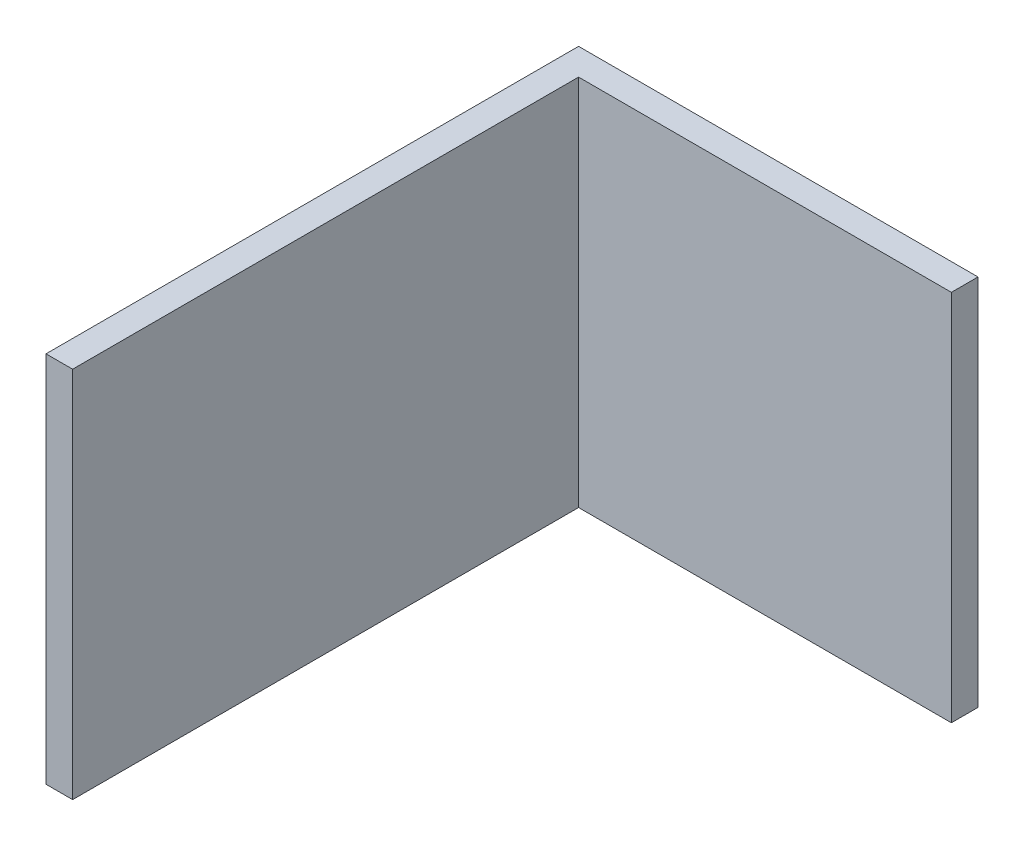
ISO-10303-21;
HEADER;
FILE_DESCRIPTION(('STEP AP214'),'2;1');
FILE_NAME('part.step','',(''),(''),'','','');
FILE_SCHEMA(('AUTOMOTIVE_DESIGN { 1 0 10303 214 1 1 1 1 }'));
ENDSEC;
DATA;
#1=APPLICATION_CONTEXT('core data for automotive mechanical design processes');
#2=APPLICATION_PROTOCOL_DEFINITION('international standard','automotive_design',2000,#1);
#3=PRODUCT_CONTEXT('',#1,'mechanical');
#4=PRODUCT('Part','Part','',(#3));
#5=PRODUCT_RELATED_PRODUCT_CATEGORY('part','',(#4));
#6=PRODUCT_DEFINITION_FORMATION('','',#4);
#7=PRODUCT_DEFINITION_CONTEXT('part definition',#1,'design');
#8=PRODUCT_DEFINITION('design','',#6,#7);
#9=PRODUCT_DEFINITION_SHAPE('','',#8);
#10=(LENGTH_UNIT() NAMED_UNIT(*) SI_UNIT(.MILLI.,.METRE.));
#11=(NAMED_UNIT(*) PLANE_ANGLE_UNIT() SI_UNIT($,.RADIAN.));
#12=(NAMED_UNIT(*) SI_UNIT($,.STERADIAN.) SOLID_ANGLE_UNIT());
#13=UNCERTAINTY_MEASURE_WITH_UNIT(LENGTH_MEASURE(1.E-05),#10,'distance_accuracy_value','');
#14=(GEOMETRIC_REPRESENTATION_CONTEXT(3) GLOBAL_UNCERTAINTY_ASSIGNED_CONTEXT((#13)) GLOBAL_UNIT_ASSIGNED_CONTEXT((#10,
#11,#12)) REPRESENTATION_CONTEXT('',''));
#15=CARTESIAN_POINT('',(0.,0.,0.));
#16=DIRECTION('',(0.,0.,1.));
#17=DIRECTION('',(1.,0.,0.));
#18=AXIS2_PLACEMENT_3D('',#15,#16,#17);
#19=CARTESIAN_POINT('',(500.,0.,10000.));
#20=DIRECTION('',(-1.,0.,0.));
#21=DIRECTION('',(0.,0.,1.));
#22=AXIS2_PLACEMENT_3D('',#19,#20,#21);
#23=PLANE('',#22);
#24=DIRECTION('',(0.,-1.,0.));
#25=VECTOR('',#24,1.);
#26=CARTESIAN_POINT('',(500.,0.,500.));
#27=LINE('',#26,#25);
#28=CARTESIAN_POINT('',(500.,7000.,500.));
#29=VERTEX_POINT('',#28);
#30=CARTESIAN_POINT('',(500.,0.,500.));
#31=VERTEX_POINT('',#30);
#32=EDGE_CURVE('E50',#29,#31,#27,.T.);
#33=ORIENTED_EDGE('',*,*,#32,.F.);
#34=DIRECTION('',(0.,0.,-1.));
#35=VECTOR('',#34,1.);
#36=CARTESIAN_POINT('',(500.,7000.,10000.));
#37=LINE('',#36,#35);
#38=CARTESIAN_POINT('',(500.,7000.,10000.));
#39=VERTEX_POINT('',#38);
#40=EDGE_CURVE('E136',#39,#29,#37,.T.);
#41=ORIENTED_EDGE('',*,*,#40,.F.);
#42=DIRECTION('',(0.,1.,0.));
#43=VECTOR('',#42,1.);
#44=CARTESIAN_POINT('',(500.,0.,10000.));
#45=LINE('',#44,#43);
#46=CARTESIAN_POINT('',(500.,0.,10000.));
#47=VERTEX_POINT('',#46);
#48=EDGE_CURVE('E129',#47,#39,#45,.T.);
#49=ORIENTED_EDGE('',*,*,#48,.F.);
#50=DIRECTION('',(0.,0.,-1.));
#51=VECTOR('',#50,1.);
#52=CARTESIAN_POINT('',(500.,0.,10000.));
#53=LINE('',#52,#51);
#54=EDGE_CURVE('E43',#47,#31,#53,.T.);
#55=ORIENTED_EDGE('',*,*,#54,.T.);
#56=EDGE_LOOP('',(#33,#41,#49,#55));
#57=FACE_BOUND('',#56,.T.);
#58=ADVANCED_FACE('F35',(#57),#23,.F.);
#59=CARTESIAN_POINT('',(0.,0.,10000.));
#60=DIRECTION('',(1.,0.,0.));
#61=DIRECTION('',(0.,0.,-1.));
#62=AXIS2_PLACEMENT_3D('',#59,#60,#61);
#63=PLANE('',#62);
#64=DIRECTION('',(0.,-1.,0.));
#65=VECTOR('',#64,1.);
#66=CARTESIAN_POINT('',(0.,0.,0.));
#67=LINE('',#66,#65);
#68=CARTESIAN_POINT('',(0.,7000.,0.));
#69=VERTEX_POINT('',#68);
#70=CARTESIAN_POINT('',(0.,0.,0.));
#71=VERTEX_POINT('',#70);
#72=EDGE_CURVE('E101',#69,#71,#67,.T.);
#73=ORIENTED_EDGE('',*,*,#72,.T.);
#74=DIRECTION('',(0.,0.,-1.));
#75=VECTOR('',#74,1.);
#76=CARTESIAN_POINT('',(0.,0.,10000.));
#77=LINE('',#76,#75);
#78=CARTESIAN_POINT('',(0.,0.,10000.));
#79=VERTEX_POINT('',#78);
#80=EDGE_CURVE('E11',#79,#71,#77,.T.);
#81=ORIENTED_EDGE('',*,*,#80,.F.);
#82=DIRECTION('',(0.,-1.,0.));
#83=VECTOR('',#82,1.);
#84=CARTESIAN_POINT('',(0.,0.,10000.));
#85=LINE('',#84,#83);
#86=CARTESIAN_POINT('',(0.,7000.,10000.));
#87=VERTEX_POINT('',#86);
#88=EDGE_CURVE('E102',#87,#79,#85,.T.);
#89=ORIENTED_EDGE('',*,*,#88,.F.);
#90=DIRECTION('',(0.,0.,-1.));
#91=VECTOR('',#90,1.);
#92=CARTESIAN_POINT('',(0.,7000.,10000.));
#93=LINE('',#92,#91);
#94=EDGE_CURVE('E132',#87,#69,#93,.T.);
#95=ORIENTED_EDGE('',*,*,#94,.T.);
#96=EDGE_LOOP('',(#73,#81,#89,#95));
#97=FACE_BOUND('',#96,.T.);
#98=ADVANCED_FACE('F37',(#97),#63,.F.);
#99=CARTESIAN_POINT('',(0.,0.,10000.));
#100=DIRECTION('',(0.,1.,0.));
#101=DIRECTION('',(0.,0.,1.));
#102=AXIS2_PLACEMENT_3D('',#99,#100,#101);
#103=PLANE('',#102);
#104=DIRECTION('',(1.,0.,0.));
#105=VECTOR('',#104,1.);
#106=CARTESIAN_POINT('',(0.,0.,0.));
#107=LINE('',#106,#105);
#108=CARTESIAN_POINT('',(7500.,0.,0.));
#109=VERTEX_POINT('',#108);
#110=EDGE_CURVE('E103',#71,#109,#107,.T.);
#111=ORIENTED_EDGE('',*,*,#110,.T.);
#112=DIRECTION('',(0.,0.,-1.));
#113=VECTOR('',#112,1.);
#114=CARTESIAN_POINT('',(7500.,0.,0.));
#115=LINE('',#114,#113);
#116=CARTESIAN_POINT('',(7500.,0.,500.));
#117=VERTEX_POINT('',#116);
#118=EDGE_CURVE('E117',#117,#109,#115,.T.);
#119=ORIENTED_EDGE('',*,*,#118,.F.);
#120=DIRECTION('',(-1.,0.,0.));
#121=VECTOR('',#120,1.);
#122=CARTESIAN_POINT('',(7500.,0.,500.));
#123=LINE('',#122,#121);
#124=EDGE_CURVE('E122',#117,#31,#123,.T.);
#125=ORIENTED_EDGE('',*,*,#124,.T.);
#126=ORIENTED_EDGE('',*,*,#54,.F.);
#127=DIRECTION('',(1.,0.,0.));
#128=VECTOR('',#127,1.);
#129=CARTESIAN_POINT('',(0.,0.,10000.));
#130=LINE('',#129,#128);
#131=EDGE_CURVE('E81',#79,#47,#130,.T.);
#132=ORIENTED_EDGE('',*,*,#131,.F.);
#133=ORIENTED_EDGE('',*,*,#80,.T.);
#134=EDGE_LOOP('',(#111,#119,#125,#126,#132,#133));
#135=FACE_BOUND('',#134,.T.);
#136=ADVANCED_FACE('F141',(#135),#103,.F.);
#137=CARTESIAN_POINT('',(0.,7000.,10000.));
#138=DIRECTION('',(0.,-1.,0.));
#139=DIRECTION('',(0.,0.,-1.));
#140=AXIS2_PLACEMENT_3D('',#137,#138,#139);
#141=PLANE('',#140);
#142=DIRECTION('',(-1.,0.,0.));
#143=VECTOR('',#142,1.);
#144=CARTESIAN_POINT('',(0.,7000.,0.));
#145=LINE('',#144,#143);
#146=CARTESIAN_POINT('',(7500.,7000.,0.));
#147=VERTEX_POINT('',#146);
#148=EDGE_CURVE('E74',#147,#69,#145,.T.);
#149=ORIENTED_EDGE('',*,*,#148,.T.);
#150=ORIENTED_EDGE('',*,*,#94,.F.);
#151=DIRECTION('',(-1.,0.,0.));
#152=VECTOR('',#151,1.);
#153=CARTESIAN_POINT('',(0.,7000.,10000.));
#154=LINE('',#153,#152);
#155=EDGE_CURVE('E59',#39,#87,#154,.T.);
#156=ORIENTED_EDGE('',*,*,#155,.F.);
#157=ORIENTED_EDGE('',*,*,#40,.T.);
#158=DIRECTION('',(-1.,0.,0.));
#159=VECTOR('',#158,1.);
#160=CARTESIAN_POINT('',(7500.,7000.,500.));
#161=LINE('',#160,#159);
#162=CARTESIAN_POINT('',(7500.,7000.,500.));
#163=VERTEX_POINT('',#162);
#164=EDGE_CURVE('E109',#163,#29,#161,.T.);
#165=ORIENTED_EDGE('',*,*,#164,.F.);
#166=DIRECTION('',(0.,0.,1.));
#167=VECTOR('',#166,1.);
#168=CARTESIAN_POINT('',(7500.,7000.,0.));
#169=LINE('',#168,#167);
#170=EDGE_CURVE('E106',#147,#163,#169,.T.);
#171=ORIENTED_EDGE('',*,*,#170,.F.);
#172=EDGE_LOOP('',(#149,#150,#156,#157,#165,#171));
#173=FACE_BOUND('',#172,.T.);
#174=ADVANCED_FACE('F107',(#173),#141,.F.);
#175=CARTESIAN_POINT('',(0.,0.,10000.));
#176=DIRECTION('',(0.,0.,-1.));
#177=DIRECTION('',(-1.,0.,0.));
#178=AXIS2_PLACEMENT_3D('',#175,#176,#177);
#179=PLANE('',#178);
#180=ORIENTED_EDGE('',*,*,#88,.T.);
#181=ORIENTED_EDGE('',*,*,#131,.T.);
#182=ORIENTED_EDGE('',*,*,#48,.T.);
#183=ORIENTED_EDGE('',*,*,#155,.T.);
#184=EDGE_LOOP('',(#180,#181,#182,#183));
#185=FACE_BOUND('',#184,.T.);
#186=ADVANCED_FACE('F145',(#185),#179,.F.);
#187=CARTESIAN_POINT('',(0.,0.,0.));
#188=DIRECTION('',(0.,0.,-1.));
#189=DIRECTION('',(-1.,0.,0.));
#190=AXIS2_PLACEMENT_3D('',#187,#188,#189);
#191=PLANE('',#190);
#192=ORIENTED_EDGE('',*,*,#72,.F.);
#193=ORIENTED_EDGE('',*,*,#148,.F.);
#194=DIRECTION('',(0.,1.,0.));
#195=VECTOR('',#194,1.);
#196=CARTESIAN_POINT('',(7500.,0.,0.));
#197=LINE('',#196,#195);
#198=EDGE_CURVE('E99',#109,#147,#197,.T.);
#199=ORIENTED_EDGE('',*,*,#198,.F.);
#200=ORIENTED_EDGE('',*,*,#110,.F.);
#201=EDGE_LOOP('',(#192,#193,#199,#200));
#202=FACE_BOUND('',#201,.T.);
#203=ADVANCED_FACE('F97',(#202),#191,.T.);
#204=CARTESIAN_POINT('',(7500.,0.,500.));
#205=DIRECTION('',(0.,0.,-1.));
#206=DIRECTION('',(-1.,0.,0.));
#207=AXIS2_PLACEMENT_3D('',#204,#205,#206);
#208=PLANE('',#207);
#209=ORIENTED_EDGE('',*,*,#32,.T.);
#210=ORIENTED_EDGE('',*,*,#124,.F.);
#211=DIRECTION('',(0.,-1.,0.));
#212=VECTOR('',#211,1.);
#213=CARTESIAN_POINT('',(7500.,0.,500.));
#214=LINE('',#213,#212);
#215=EDGE_CURVE('E112',#163,#117,#214,.T.);
#216=ORIENTED_EDGE('',*,*,#215,.F.);
#217=ORIENTED_EDGE('',*,*,#164,.T.);
#218=EDGE_LOOP('',(#209,#210,#216,#217));
#219=FACE_BOUND('',#218,.T.);
#220=ADVANCED_FACE('F140',(#219),#208,.F.);
#221=CARTESIAN_POINT('',(7500.,0.,0.));
#222=DIRECTION('',(1.,0.,0.));
#223=DIRECTION('',(0.,0.,-1.));
#224=AXIS2_PLACEMENT_3D('',#221,#222,#223);
#225=PLANE('',#224);
#226=ORIENTED_EDGE('',*,*,#198,.T.);
#227=ORIENTED_EDGE('',*,*,#170,.T.);
#228=ORIENTED_EDGE('',*,*,#215,.T.);
#229=ORIENTED_EDGE('',*,*,#118,.T.);
#230=EDGE_LOOP('',(#226,#227,#228,#229));
#231=FACE_BOUND('',#230,.T.);
#232=ADVANCED_FACE('F115',(#231),#225,.T.);
#233=CLOSED_SHELL('',(#58,#98,#136,#174,#186,#203,#220,#232));
#234=MANIFOLD_SOLID_BREP('B2',#233);
#235=ADVANCED_BREP_SHAPE_REPRESENTATION('',(#18,#234),#14);
#236=SHAPE_DEFINITION_REPRESENTATION(#9,#235);
ENDSEC;
END-ISO-10303-21;
